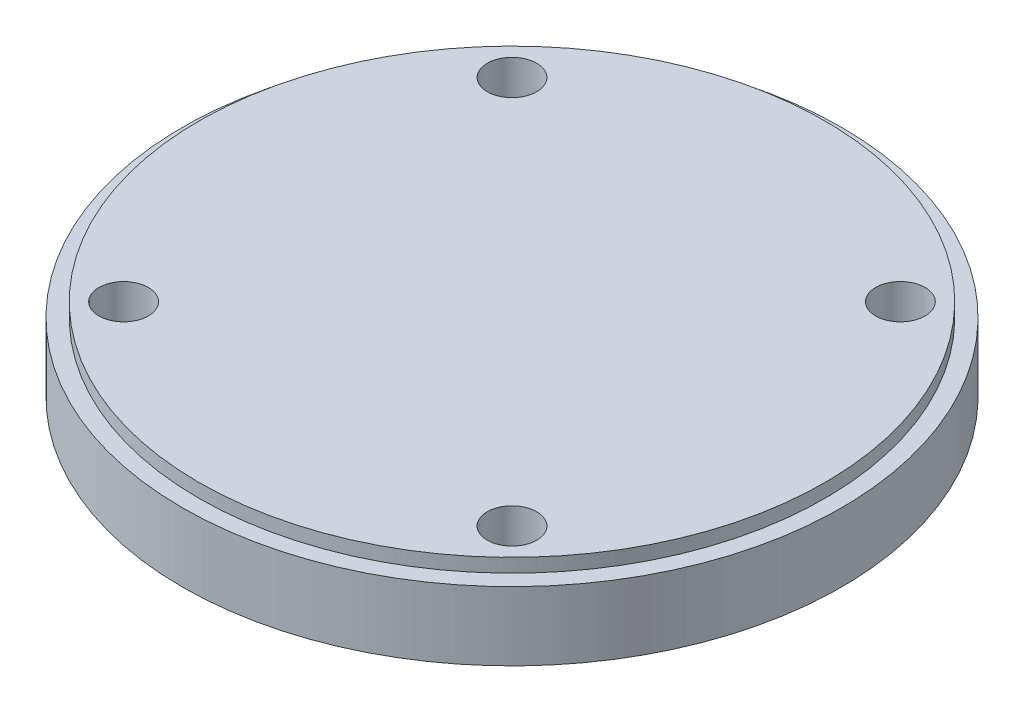
ISO-10303-21;
HEADER;
FILE_DESCRIPTION(('STEP AP214'),'2;1');
FILE_NAME('part.step','',(''),(''),'','','');
FILE_SCHEMA(('AUTOMOTIVE_DESIGN { 1 0 10303 214 1 1 1 1 }'));
ENDSEC;
DATA;
#1=APPLICATION_CONTEXT('core data for automotive mechanical design processes');
#2=APPLICATION_PROTOCOL_DEFINITION('international standard','automotive_design',2000,#1);
#3=PRODUCT_CONTEXT('',#1,'mechanical');
#4=PRODUCT('Part','Part','',(#3));
#5=PRODUCT_RELATED_PRODUCT_CATEGORY('part','',(#4));
#6=PRODUCT_DEFINITION_FORMATION('','',#4);
#7=PRODUCT_DEFINITION_CONTEXT('part definition',#1,'design');
#8=PRODUCT_DEFINITION('design','',#6,#7);
#9=PRODUCT_DEFINITION_SHAPE('','',#8);
#10=(LENGTH_UNIT() NAMED_UNIT(*) SI_UNIT(.MILLI.,.METRE.));
#11=(NAMED_UNIT(*) PLANE_ANGLE_UNIT() SI_UNIT($,.RADIAN.));
#12=(NAMED_UNIT(*) SI_UNIT($,.STERADIAN.) SOLID_ANGLE_UNIT());
#13=UNCERTAINTY_MEASURE_WITH_UNIT(LENGTH_MEASURE(1.E-05),#10,'distance_accuracy_value','');
#14=(GEOMETRIC_REPRESENTATION_CONTEXT(3) GLOBAL_UNCERTAINTY_ASSIGNED_CONTEXT((#13)) GLOBAL_UNIT_ASSIGNED_CONTEXT((#10,
#11,#12)) REPRESENTATION_CONTEXT('',''));
#15=CARTESIAN_POINT('',(0.,0.,0.));
#16=DIRECTION('',(0.,0.,1.));
#17=DIRECTION('',(1.,0.,0.));
#18=AXIS2_PLACEMENT_3D('',#15,#16,#17);
#19=CARTESIAN_POINT('',(0.,7.5,0.));
#20=DIRECTION('',(0.,-1.,0.));
#21=DIRECTION('',(0.,0.,-1.));
#22=AXIS2_PLACEMENT_3D('',#19,#20,#21);
#23=CYLINDRICAL_SURFACE('',#22,57.);
#24=CARTESIAN_POINT('',(0.,5.,0.));
#25=DIRECTION('',(0.,1.,0.));
#26=DIRECTION('',(0.,0.,1.));
#27=AXIS2_PLACEMENT_3D('',#24,#25,#26);
#28=CIRCLE('',#27,57.);
#29=CARTESIAN_POINT('',(0.,5.,57.));
#30=VERTEX_POINT('',#29);
#31=EDGE_CURVE('E40',#30,#30,#28,.T.);
#32=ORIENTED_EDGE('',*,*,#31,.T.);
#33=EDGE_LOOP('',(#32));
#34=FACE_BOUND('',#33,.T.);
#35=CARTESIAN_POINT('',(0.,7.5,0.));
#36=DIRECTION('',(0.,1.,0.));
#37=DIRECTION('',(0.,0.,1.));
#38=AXIS2_PLACEMENT_3D('',#35,#36,#37);
#39=CIRCLE('',#38,57.);
#40=CARTESIAN_POINT('',(0.,7.5,57.));
#41=VERTEX_POINT('',#40);
#42=EDGE_CURVE('E10',#41,#41,#39,.T.);
#43=ORIENTED_EDGE('',*,*,#42,.F.);
#44=EDGE_LOOP('',(#43));
#45=FACE_BOUND('',#44,.T.);
#46=ADVANCED_FACE('F30',(#34,#45),#23,.T.);
#47=CARTESIAN_POINT('',(0.,7.5,0.));
#48=DIRECTION('',(0.,1.,0.));
#49=DIRECTION('',(0.,0.,1.));
#50=AXIS2_PLACEMENT_3D('',#47,#48,#49);
#51=PLANE('',#50);
#52=CARTESIAN_POINT('',(35.3553390593272,7.5,35.3553390593275));
#53=DIRECTION('',(0.,1.,0.));
#54=DIRECTION('',(0.,0.,1.));
#55=AXIS2_PLACEMENT_3D('',#52,#53,#54);
#56=CIRCLE('',#55,4.49999999999999);
#57=CARTESIAN_POINT('',(35.3553390593272,7.5,39.8553390593275));
#58=VERTEX_POINT('',#57);
#59=EDGE_CURVE('E70',#58,#58,#56,.T.);
#60=ORIENTED_EDGE('',*,*,#59,.F.);
#61=EDGE_LOOP('',(#60));
#62=FACE_BOUND('',#61,.T.);
#63=CARTESIAN_POINT('',(35.3553390593272,7.5,-35.3553390593276));
#64=DIRECTION('',(0.,1.,0.));
#65=DIRECTION('',(0.,0.,1.));
#66=AXIS2_PLACEMENT_3D('',#63,#64,#65);
#67=CIRCLE('',#66,4.49999999999999);
#68=CARTESIAN_POINT('',(35.3553390593272,7.5,-30.8553390593276));
#69=VERTEX_POINT('',#68);
#70=EDGE_CURVE('E64',#69,#69,#67,.T.);
#71=ORIENTED_EDGE('',*,*,#70,.F.);
#72=EDGE_LOOP('',(#71));
#73=FACE_BOUND('',#72,.T.);
#74=CARTESIAN_POINT('',(-35.3553390593275,7.5,-35.3553390593273));
#75=DIRECTION('',(0.,1.,0.));
#76=DIRECTION('',(0.,0.,1.));
#77=AXIS2_PLACEMENT_3D('',#74,#75,#76);
#78=CIRCLE('',#77,4.49999999999999);
#79=CARTESIAN_POINT('',(-35.3553390593275,7.5,-30.8553390593273));
#80=VERTEX_POINT('',#79);
#81=EDGE_CURVE('E58',#80,#80,#78,.T.);
#82=ORIENTED_EDGE('',*,*,#81,.F.);
#83=EDGE_LOOP('',(#82));
#84=FACE_BOUND('',#83,.T.);
#85=CARTESIAN_POINT('',(-35.3553390593272,7.5,35.3553390593276));
#86=DIRECTION('',(0.,1.,0.));
#87=DIRECTION('',(0.,0.,1.));
#88=AXIS2_PLACEMENT_3D('',#85,#86,#87);
#89=CIRCLE('',#88,4.49999999999999);
#90=CARTESIAN_POINT('',(-35.3553390593272,7.5,39.8553390593276));
#91=VERTEX_POINT('',#90);
#92=EDGE_CURVE('E52',#91,#91,#89,.T.);
#93=ORIENTED_EDGE('',*,*,#92,.F.);
#94=EDGE_LOOP('',(#93));
#95=FACE_BOUND('',#94,.T.);
#96=ORIENTED_EDGE('',*,*,#42,.T.);
#97=EDGE_LOOP('',(#96));
#98=FACE_BOUND('',#97,.T.);
#99=ADVANCED_FACE('F76',(#62,#73,#84,#95,#98),#51,.T.);
#100=CARTESIAN_POINT('',(0.,5.,0.));
#101=DIRECTION('',(0.,1.,0.));
#102=DIRECTION('',(0.,0.,1.));
#103=AXIS2_PLACEMENT_3D('',#100,#101,#102);
#104=PLANE('',#103);
#105=CARTESIAN_POINT('',(0.,5.,0.));
#106=DIRECTION('',(0.,1.,0.));
#107=DIRECTION('',(0.,0.,1.));
#108=AXIS2_PLACEMENT_3D('',#105,#106,#107);
#109=CIRCLE('',#108,60.);
#110=CARTESIAN_POINT('',(0.,5.,60.));
#111=VERTEX_POINT('',#110);
#112=EDGE_CURVE('E36',#111,#111,#109,.T.);
#113=ORIENTED_EDGE('',*,*,#112,.T.);
#114=EDGE_LOOP('',(#113));
#115=FACE_BOUND('',#114,.T.);
#116=ORIENTED_EDGE('',*,*,#31,.F.);
#117=EDGE_LOOP('',(#116));
#118=FACE_BOUND('',#117,.T.);
#119=ADVANCED_FACE('F79',(#115,#118),#104,.T.);
#120=CARTESIAN_POINT('',(0.,5.,0.));
#121=DIRECTION('',(0.,-1.,0.));
#122=DIRECTION('',(0.,0.,-1.));
#123=AXIS2_PLACEMENT_3D('',#120,#121,#122);
#124=CYLINDRICAL_SURFACE('',#123,60.);
#125=ORIENTED_EDGE('',*,*,#112,.F.);
#126=EDGE_LOOP('',(#125));
#127=FACE_BOUND('',#126,.T.);
#128=CARTESIAN_POINT('',(0.,-7.50000000000001,0.));
#129=DIRECTION('',(0.,1.,0.));
#130=DIRECTION('',(0.,0.,1.));
#131=AXIS2_PLACEMENT_3D('',#128,#129,#130);
#132=CIRCLE('',#131,60.);
#133=CARTESIAN_POINT('',(0.,-7.50000000000001,60.));
#134=VERTEX_POINT('',#133);
#135=EDGE_CURVE('E44',#134,#134,#132,.F.);
#136=ORIENTED_EDGE('',*,*,#135,.F.);
#137=EDGE_LOOP('',(#136));
#138=FACE_BOUND('',#137,.T.);
#139=ADVANCED_FACE('F100',(#127,#138),#124,.T.);
#140=CARTESIAN_POINT('',(0.,-7.5,0.));
#141=DIRECTION('',(0.,1.,0.));
#142=DIRECTION('',(0.,0.,1.));
#143=AXIS2_PLACEMENT_3D('',#140,#141,#142);
#144=PLANE('',#143);
#145=CARTESIAN_POINT('',(35.3553390593272,-7.50000000000001,35.3553390593275));
#146=DIRECTION('',(0.,1.,0.));
#147=DIRECTION('',(0.,0.,1.));
#148=AXIS2_PLACEMENT_3D('',#145,#146,#147);
#149=CIRCLE('',#148,4.5);
#150=CARTESIAN_POINT('',(35.3553390593272,-7.50000000000001,39.8553390593275));
#151=VERTEX_POINT('',#150);
#152=EDGE_CURVE('E67',#151,#151,#149,.T.);
#153=ORIENTED_EDGE('',*,*,#152,.T.);
#154=EDGE_LOOP('',(#153));
#155=FACE_BOUND('',#154,.T.);
#156=CARTESIAN_POINT('',(35.3553390593272,-7.50000000000001,-35.3553390593276));
#157=DIRECTION('',(0.,1.,0.));
#158=DIRECTION('',(0.,0.,1.));
#159=AXIS2_PLACEMENT_3D('',#156,#157,#158);
#160=CIRCLE('',#159,4.5);
#161=CARTESIAN_POINT('',(35.3553390593272,-7.50000000000001,-30.8553390593276));
#162=VERTEX_POINT('',#161);
#163=EDGE_CURVE('E61',#162,#162,#160,.T.);
#164=ORIENTED_EDGE('',*,*,#163,.T.);
#165=EDGE_LOOP('',(#164));
#166=FACE_BOUND('',#165,.T.);
#167=CARTESIAN_POINT('',(-35.3553390593275,-7.50000000000001,-35.3553390593273));
#168=DIRECTION('',(0.,1.,0.));
#169=DIRECTION('',(0.,0.,1.));
#170=AXIS2_PLACEMENT_3D('',#167,#168,#169);
#171=CIRCLE('',#170,4.5);
#172=CARTESIAN_POINT('',(-35.3553390593275,-7.50000000000001,-30.8553390593273));
#173=VERTEX_POINT('',#172);
#174=EDGE_CURVE('E55',#173,#173,#171,.T.);
#175=ORIENTED_EDGE('',*,*,#174,.T.);
#176=EDGE_LOOP('',(#175));
#177=FACE_BOUND('',#176,.T.);
#178=CARTESIAN_POINT('',(-35.3553390593272,-7.50000000000001,35.3553390593276));
#179=DIRECTION('',(0.,1.,0.));
#180=DIRECTION('',(0.,0.,1.));
#181=AXIS2_PLACEMENT_3D('',#178,#179,#180);
#182=CIRCLE('',#181,4.5);
#183=CARTESIAN_POINT('',(-35.3553390593272,-7.50000000000001,39.8553390593276));
#184=VERTEX_POINT('',#183);
#185=EDGE_CURVE('E49',#184,#184,#182,.T.);
#186=ORIENTED_EDGE('',*,*,#185,.T.);
#187=EDGE_LOOP('',(#186));
#188=FACE_BOUND('',#187,.T.);
#189=ORIENTED_EDGE('',*,*,#135,.T.);
#190=EDGE_LOOP('',(#189));
#191=FACE_BOUND('',#190,.T.);
#192=ADVANCED_FACE('F90',(#155,#166,#177,#188,#191),#144,.F.);
#193=CARTESIAN_POINT('',(-35.3553390593272,7.5,35.3553390593276));
#194=DIRECTION('',(0.,1.,0.));
#195=DIRECTION('',(0.,0.,1.));
#196=AXIS2_PLACEMENT_3D('',#193,#194,#195);
#197=CYLINDRICAL_SURFACE('',#196,4.49999999999999);
#198=ORIENTED_EDGE('',*,*,#185,.F.);
#199=EDGE_LOOP('',(#198));
#200=FACE_BOUND('',#199,.T.);
#201=ORIENTED_EDGE('',*,*,#92,.T.);
#202=EDGE_LOOP('',(#201));
#203=FACE_BOUND('',#202,.T.);
#204=ADVANCED_FACE('F87',(#200,#203),#197,.F.);
#205=CARTESIAN_POINT('',(-35.3553390593275,7.5,-35.3553390593273));
#206=DIRECTION('',(0.,1.,0.));
#207=DIRECTION('',(0.,0.,1.));
#208=AXIS2_PLACEMENT_3D('',#205,#206,#207);
#209=CYLINDRICAL_SURFACE('',#208,4.49999999999999);
#210=ORIENTED_EDGE('',*,*,#174,.F.);
#211=EDGE_LOOP('',(#210));
#212=FACE_BOUND('',#211,.T.);
#213=ORIENTED_EDGE('',*,*,#81,.T.);
#214=EDGE_LOOP('',(#213));
#215=FACE_BOUND('',#214,.T.);
#216=ADVANCED_FACE('F89',(#212,#215),#209,.F.);
#217=CARTESIAN_POINT('',(35.3553390593272,7.5,-35.3553390593276));
#218=DIRECTION('',(0.,1.,0.));
#219=DIRECTION('',(0.,0.,1.));
#220=AXIS2_PLACEMENT_3D('',#217,#218,#219);
#221=CYLINDRICAL_SURFACE('',#220,4.49999999999999);
#222=ORIENTED_EDGE('',*,*,#163,.F.);
#223=EDGE_LOOP('',(#222));
#224=FACE_BOUND('',#223,.T.);
#225=ORIENTED_EDGE('',*,*,#70,.T.);
#226=EDGE_LOOP('',(#225));
#227=FACE_BOUND('',#226,.T.);
#228=ADVANCED_FACE('F97',(#224,#227),#221,.F.);
#229=CARTESIAN_POINT('',(35.3553390593272,7.5,35.3553390593275));
#230=DIRECTION('',(0.,1.,0.));
#231=DIRECTION('',(0.,0.,1.));
#232=AXIS2_PLACEMENT_3D('',#229,#230,#231);
#233=CYLINDRICAL_SURFACE('',#232,4.49999999999999);
#234=ORIENTED_EDGE('',*,*,#152,.F.);
#235=EDGE_LOOP('',(#234));
#236=FACE_BOUND('',#235,.T.);
#237=ORIENTED_EDGE('',*,*,#59,.T.);
#238=EDGE_LOOP('',(#237));
#239=FACE_BOUND('',#238,.T.);
#240=ADVANCED_FACE('F74',(#236,#239),#233,.F.);
#241=CLOSED_SHELL('',(#46,#99,#119,#139,#192,#204,#216,#228,#240));
#242=MANIFOLD_SOLID_BREP('B2',#241);
#243=ADVANCED_BREP_SHAPE_REPRESENTATION('',(#18,#242),#14);
#244=SHAPE_DEFINITION_REPRESENTATION(#9,#243);
ENDSEC;
END-ISO-10303-21;
